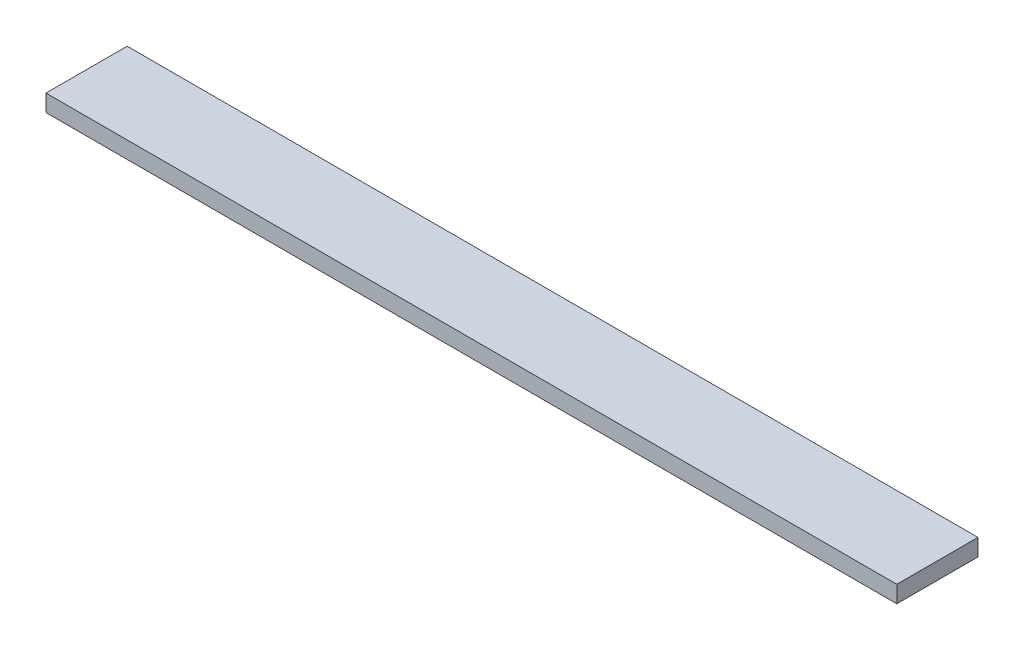
ISO-10303-21;
HEADER;
FILE_DESCRIPTION(('STEP AP214'),'2;1');
FILE_NAME('part.step','',(''),(''),'','','');
FILE_SCHEMA(('AUTOMOTIVE_DESIGN { 1 0 10303 214 1 1 1 1 }'));
ENDSEC;
DATA;
#1=APPLICATION_CONTEXT('core data for automotive mechanical design processes');
#2=APPLICATION_PROTOCOL_DEFINITION('international standard','automotive_design',2000,#1);
#3=PRODUCT_CONTEXT('',#1,'mechanical');
#4=PRODUCT('Part','Part','',(#3));
#5=PRODUCT_RELATED_PRODUCT_CATEGORY('part','',(#4));
#6=PRODUCT_DEFINITION_FORMATION('','',#4);
#7=PRODUCT_DEFINITION_CONTEXT('part definition',#1,'design');
#8=PRODUCT_DEFINITION('design','',#6,#7);
#9=PRODUCT_DEFINITION_SHAPE('','',#8);
#10=(LENGTH_UNIT() NAMED_UNIT(*) SI_UNIT(.MILLI.,.METRE.));
#11=(NAMED_UNIT(*) PLANE_ANGLE_UNIT() SI_UNIT($,.RADIAN.));
#12=(NAMED_UNIT(*) SI_UNIT($,.STERADIAN.) SOLID_ANGLE_UNIT());
#13=UNCERTAINTY_MEASURE_WITH_UNIT(LENGTH_MEASURE(1.E-05),#10,'distance_accuracy_value','');
#14=(GEOMETRIC_REPRESENTATION_CONTEXT(3) GLOBAL_UNCERTAINTY_ASSIGNED_CONTEXT((#13)) GLOBAL_UNIT_ASSIGNED_CONTEXT((#10,
#11,#12)) REPRESENTATION_CONTEXT('',''));
#15=CARTESIAN_POINT('',(0.,0.,0.));
#16=DIRECTION('',(0.,0.,1.));
#17=DIRECTION('',(1.,0.,0.));
#18=AXIS2_PLACEMENT_3D('',#15,#16,#17);
#19=CARTESIAN_POINT('',(503.,0.,0.));
#20=DIRECTION('',(0.,0.,-1.));
#21=DIRECTION('',(-1.,0.,0.));
#22=AXIS2_PLACEMENT_3D('',#19,#20,#21);
#23=PLANE('',#22);
#24=DIRECTION('',(0.,-1.,0.));
#25=VECTOR('',#24,1.);
#26=CARTESIAN_POINT('',(0.,0.,0.));
#27=LINE('',#26,#25);
#28=CARTESIAN_POINT('',(0.,10.,0.));
#29=VERTEX_POINT('',#28);
#30=CARTESIAN_POINT('',(0.,0.,0.));
#31=VERTEX_POINT('',#30);
#32=EDGE_CURVE('E95',#29,#31,#27,.T.);
#33=ORIENTED_EDGE('',*,*,#32,.T.);
#34=DIRECTION('',(-1.,0.,0.));
#35=VECTOR('',#34,1.);
#36=CARTESIAN_POINT('',(503.,0.,0.));
#37=LINE('',#36,#35);
#38=CARTESIAN_POINT('',(503.,0.,0.));
#39=VERTEX_POINT('',#38);
#40=EDGE_CURVE('E11',#39,#31,#37,.T.);
#41=ORIENTED_EDGE('',*,*,#40,.F.);
#42=DIRECTION('',(0.,-1.,0.));
#43=VECTOR('',#42,1.);
#44=CARTESIAN_POINT('',(503.,0.,0.));
#45=LINE('',#44,#43);
#46=CARTESIAN_POINT('',(503.,10.,0.));
#47=VERTEX_POINT('',#46);
#48=EDGE_CURVE('E83',#47,#39,#45,.T.);
#49=ORIENTED_EDGE('',*,*,#48,.F.);
#50=DIRECTION('',(-1.,0.,0.));
#51=VECTOR('',#50,1.);
#52=CARTESIAN_POINT('',(503.,10.,0.));
#53=LINE('',#52,#51);
#54=EDGE_CURVE('E91',#47,#29,#53,.T.);
#55=ORIENTED_EDGE('',*,*,#54,.T.);
#56=EDGE_LOOP('',(#33,#41,#49,#55));
#57=FACE_BOUND('',#56,.T.);
#58=ADVANCED_FACE('F32',(#57),#23,.F.);
#59=CARTESIAN_POINT('',(503.,0.,0.));
#60=DIRECTION('',(0.,1.,0.));
#61=DIRECTION('',(0.,0.,1.));
#62=AXIS2_PLACEMENT_3D('',#59,#60,#61);
#63=PLANE('',#62);
#64=DIRECTION('',(0.,0.,-1.));
#65=VECTOR('',#64,1.);
#66=CARTESIAN_POINT('',(0.,0.,0.));
#67=LINE('',#66,#65);
#68=CARTESIAN_POINT('',(0.,0.,-48.));
#69=VERTEX_POINT('',#68);
#70=EDGE_CURVE('E87',#31,#69,#67,.T.);
#71=ORIENTED_EDGE('',*,*,#70,.T.);
#72=DIRECTION('',(-1.,0.,0.));
#73=VECTOR('',#72,1.);
#74=CARTESIAN_POINT('',(503.,0.,-48.));
#75=LINE('',#74,#73);
#76=CARTESIAN_POINT('',(503.,0.,-48.));
#77=VERTEX_POINT('',#76);
#78=EDGE_CURVE('E40',#77,#69,#75,.T.);
#79=ORIENTED_EDGE('',*,*,#78,.F.);
#80=DIRECTION('',(0.,0.,-1.));
#81=VECTOR('',#80,1.);
#82=CARTESIAN_POINT('',(503.,0.,0.));
#83=LINE('',#82,#81);
#84=EDGE_CURVE('E78',#39,#77,#83,.T.);
#85=ORIENTED_EDGE('',*,*,#84,.F.);
#86=ORIENTED_EDGE('',*,*,#40,.T.);
#87=EDGE_LOOP('',(#71,#79,#85,#86));
#88=FACE_BOUND('',#87,.T.);
#89=ADVANCED_FACE('F86',(#88),#63,.F.);
#90=CARTESIAN_POINT('',(503.,0.,-48.));
#91=DIRECTION('',(0.,0.,1.));
#92=DIRECTION('',(1.,0.,0.));
#93=AXIS2_PLACEMENT_3D('',#90,#91,#92);
#94=PLANE('',#93);
#95=DIRECTION('',(0.,1.,0.));
#96=VECTOR('',#95,1.);
#97=CARTESIAN_POINT('',(0.,0.,-48.));
#98=LINE('',#97,#96);
#99=CARTESIAN_POINT('',(0.,10.,-48.));
#100=VERTEX_POINT('',#99);
#101=EDGE_CURVE('E65',#69,#100,#98,.T.);
#102=ORIENTED_EDGE('',*,*,#101,.T.);
#103=DIRECTION('',(-1.,0.,0.));
#104=VECTOR('',#103,1.);
#105=CARTESIAN_POINT('',(503.,10.,-48.));
#106=LINE('',#105,#104);
#107=CARTESIAN_POINT('',(503.,10.,-48.));
#108=VERTEX_POINT('',#107);
#109=EDGE_CURVE('E88',#108,#100,#106,.T.);
#110=ORIENTED_EDGE('',*,*,#109,.F.);
#111=DIRECTION('',(0.,1.,0.));
#112=VECTOR('',#111,1.);
#113=CARTESIAN_POINT('',(503.,0.,-48.));
#114=LINE('',#113,#112);
#115=EDGE_CURVE('E81',#77,#108,#114,.T.);
#116=ORIENTED_EDGE('',*,*,#115,.F.);
#117=ORIENTED_EDGE('',*,*,#78,.T.);
#118=EDGE_LOOP('',(#102,#110,#116,#117));
#119=FACE_BOUND('',#118,.T.);
#120=ADVANCED_FACE('F89',(#119),#94,.F.);
#121=CARTESIAN_POINT('',(503.,10.,0.));
#122=DIRECTION('',(0.,-1.,0.));
#123=DIRECTION('',(0.,0.,-1.));
#124=AXIS2_PLACEMENT_3D('',#121,#122,#123);
#125=PLANE('',#124);
#126=DIRECTION('',(0.,0.,1.));
#127=VECTOR('',#126,1.);
#128=CARTESIAN_POINT('',(0.,10.,0.));
#129=LINE('',#128,#127);
#130=EDGE_CURVE('E71',#100,#29,#129,.T.);
#131=ORIENTED_EDGE('',*,*,#130,.T.);
#132=ORIENTED_EDGE('',*,*,#54,.F.);
#133=DIRECTION('',(0.,0.,1.));
#134=VECTOR('',#133,1.);
#135=CARTESIAN_POINT('',(503.,10.,0.));
#136=LINE('',#135,#134);
#137=EDGE_CURVE('E48',#108,#47,#136,.T.);
#138=ORIENTED_EDGE('',*,*,#137,.F.);
#139=ORIENTED_EDGE('',*,*,#109,.T.);
#140=EDGE_LOOP('',(#131,#132,#138,#139));
#141=FACE_BOUND('',#140,.T.);
#142=ADVANCED_FACE('F102',(#141),#125,.F.);
#143=CARTESIAN_POINT('',(503.,0.,0.));
#144=DIRECTION('',(-1.,0.,0.));
#145=DIRECTION('',(0.,0.,1.));
#146=AXIS2_PLACEMENT_3D('',#143,#144,#145);
#147=PLANE('',#146);
#148=ORIENTED_EDGE('',*,*,#48,.T.);
#149=ORIENTED_EDGE('',*,*,#84,.T.);
#150=ORIENTED_EDGE('',*,*,#115,.T.);
#151=ORIENTED_EDGE('',*,*,#137,.T.);
#152=EDGE_LOOP('',(#148,#149,#150,#151));
#153=FACE_BOUND('',#152,.T.);
#154=ADVANCED_FACE('F79',(#153),#147,.F.);
#155=CARTESIAN_POINT('',(0.,0.,0.));
#156=DIRECTION('',(-1.,0.,0.));
#157=DIRECTION('',(0.,0.,1.));
#158=AXIS2_PLACEMENT_3D('',#155,#156,#157);
#159=PLANE('',#158);
#160=ORIENTED_EDGE('',*,*,#32,.F.);
#161=ORIENTED_EDGE('',*,*,#130,.F.);
#162=ORIENTED_EDGE('',*,*,#101,.F.);
#163=ORIENTED_EDGE('',*,*,#70,.F.);
#164=EDGE_LOOP('',(#160,#161,#162,#163));
#165=FACE_BOUND('',#164,.T.);
#166=ADVANCED_FACE('F105',(#165),#159,.T.);
#167=CLOSED_SHELL('',(#58,#89,#120,#142,#154,#166));
#168=MANIFOLD_SOLID_BREP('B2',#167);
#169=ADVANCED_BREP_SHAPE_REPRESENTATION('',(#18,#168),#14);
#170=SHAPE_DEFINITION_REPRESENTATION(#9,#169);
ENDSEC;
END-ISO-10303-21;
